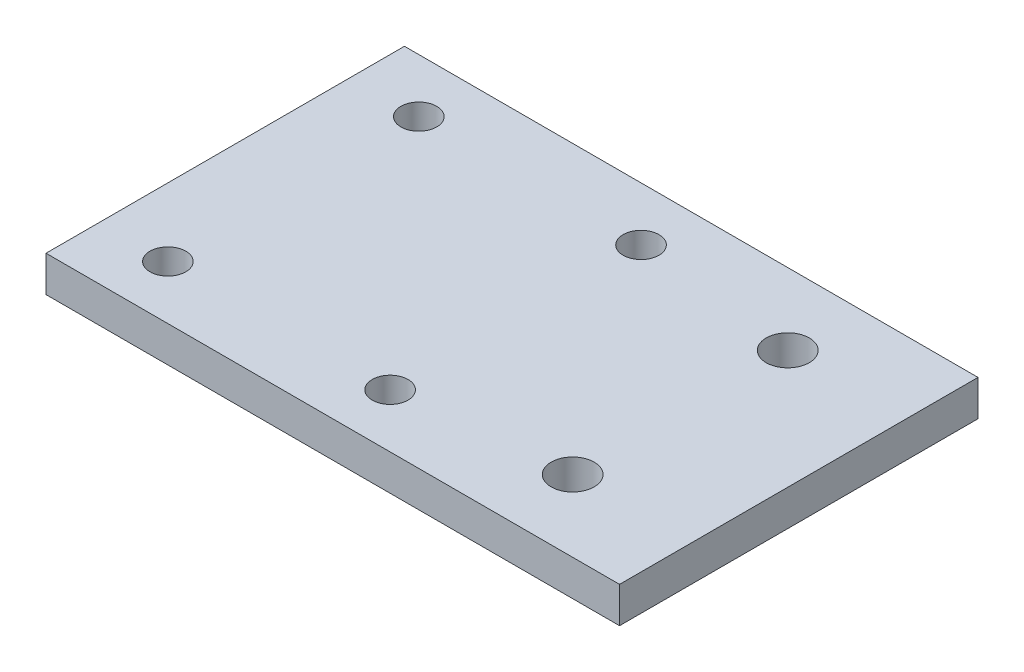
ISO-10303-21;
HEADER;
FILE_DESCRIPTION(('STEP AP214'),'2;1');
FILE_NAME('part.step','',(''),(''),'','','');
FILE_SCHEMA(('AUTOMOTIVE_DESIGN { 1 0 10303 214 1 1 1 1 }'));
ENDSEC;
DATA;
#1=APPLICATION_CONTEXT('core data for automotive mechanical design processes');
#2=APPLICATION_PROTOCOL_DEFINITION('international standard','automotive_design',2000,#1);
#3=PRODUCT_CONTEXT('',#1,'mechanical');
#4=PRODUCT('Part','Part','',(#3));
#5=PRODUCT_RELATED_PRODUCT_CATEGORY('part','',(#4));
#6=PRODUCT_DEFINITION_FORMATION('','',#4);
#7=PRODUCT_DEFINITION_CONTEXT('part definition',#1,'design');
#8=PRODUCT_DEFINITION('design','',#6,#7);
#9=PRODUCT_DEFINITION_SHAPE('','',#8);
#10=(LENGTH_UNIT() NAMED_UNIT(*) SI_UNIT(.MILLI.,.METRE.));
#11=(NAMED_UNIT(*) PLANE_ANGLE_UNIT() SI_UNIT($,.RADIAN.));
#12=(NAMED_UNIT(*) SI_UNIT($,.STERADIAN.) SOLID_ANGLE_UNIT());
#13=UNCERTAINTY_MEASURE_WITH_UNIT(LENGTH_MEASURE(1.E-05),#10,'distance_accuracy_value','');
#14=(GEOMETRIC_REPRESENTATION_CONTEXT(3) GLOBAL_UNCERTAINTY_ASSIGNED_CONTEXT((#13)) GLOBAL_UNIT_ASSIGNED_CONTEXT((#10,
#11,#12)) REPRESENTATION_CONTEXT('',''));
#15=CARTESIAN_POINT('',(0.,0.,0.));
#16=DIRECTION('',(0.,0.,1.));
#17=DIRECTION('',(1.,0.,0.));
#18=AXIS2_PLACEMENT_3D('',#15,#16,#17);
#19=CARTESIAN_POINT('',(0.,5.,0.));
#20=DIRECTION('',(0.,-1.,0.));
#21=DIRECTION('',(0.,0.,-1.));
#22=AXIS2_PLACEMENT_3D('',#19,#20,#21);
#23=PLANE('',#22);
#24=CARTESIAN_POINT('',(9.5,5.,-7.5));
#25=DIRECTION('',(0.,1.,0.));
#26=DIRECTION('',(0.,0.,1.));
#27=AXIS2_PLACEMENT_3D('',#24,#25,#26);
#28=CIRCLE('',#27,2.5);
#29=CARTESIAN_POINT('',(9.5,5.,-5.));
#30=VERTEX_POINT('',#29);
#31=EDGE_CURVE('E117',#30,#30,#28,.T.);
#32=ORIENTED_EDGE('',*,*,#31,.F.);
#33=EDGE_LOOP('',(#32));
#34=FACE_BOUND('',#33,.T.);
#35=CARTESIAN_POINT('',(40.5,5.,-42.5));
#36=DIRECTION('',(0.,1.,0.));
#37=DIRECTION('',(0.,0.,1.));
#38=AXIS2_PLACEMENT_3D('',#35,#36,#37);
#39=CIRCLE('',#38,2.5);
#40=CARTESIAN_POINT('',(40.5,5.,-40.));
#41=VERTEX_POINT('',#40);
#42=EDGE_CURVE('E236',#41,#41,#39,.T.);
#43=ORIENTED_EDGE('',*,*,#42,.F.);
#44=EDGE_LOOP('',(#43));
#45=FACE_BOUND('',#44,.T.);
#46=CARTESIAN_POINT('',(9.5,5.,-42.5));
#47=DIRECTION('',(0.,1.,0.));
#48=DIRECTION('',(0.,0.,1.));
#49=AXIS2_PLACEMENT_3D('',#46,#47,#48);
#50=CIRCLE('',#49,2.5);
#51=CARTESIAN_POINT('',(9.5,5.,-40.));
#52=VERTEX_POINT('',#51);
#53=EDGE_CURVE('E130',#52,#52,#50,.T.);
#54=ORIENTED_EDGE('',*,*,#53,.F.);
#55=EDGE_LOOP('',(#54));
#56=FACE_BOUND('',#55,.T.);
#57=CARTESIAN_POINT('',(40.5,5.,-7.5));
#58=DIRECTION('',(0.,1.,0.));
#59=DIRECTION('',(0.,0.,1.));
#60=AXIS2_PLACEMENT_3D('',#57,#58,#59);
#61=CIRCLE('',#60,2.5);
#62=CARTESIAN_POINT('',(40.5,5.,-5.));
#63=VERTEX_POINT('',#62);
#64=EDGE_CURVE('E113',#63,#63,#61,.T.);
#65=ORIENTED_EDGE('',*,*,#64,.F.);
#66=EDGE_LOOP('',(#65));
#67=FACE_BOUND('',#66,.T.);
#68=DIRECTION('',(0.,0.,1.));
#69=VECTOR('',#68,1.);
#70=CARTESIAN_POINT('',(0.,5.,0.));
#71=LINE('',#70,#69);
#72=CARTESIAN_POINT('',(0.,5.,-50.));
#73=VERTEX_POINT('',#72);
#74=CARTESIAN_POINT('',(0.,5.,0.));
#75=VERTEX_POINT('',#74);
#76=EDGE_CURVE('E87',#73,#75,#71,.T.);
#77=ORIENTED_EDGE('',*,*,#76,.T.);
#78=DIRECTION('',(1.,0.,0.));
#79=VECTOR('',#78,1.);
#80=CARTESIAN_POINT('',(0.,5.,0.));
#81=LINE('',#80,#79);
#82=CARTESIAN_POINT('',(80.,5.,0.));
#83=VERTEX_POINT('',#82);
#84=EDGE_CURVE('E82',#75,#83,#81,.T.);
#85=ORIENTED_EDGE('',*,*,#84,.T.);
#86=DIRECTION('',(0.,0.,-1.));
#87=VECTOR('',#86,1.);
#88=CARTESIAN_POINT('',(80.,5.,0.));
#89=LINE('',#88,#87);
#90=CARTESIAN_POINT('',(80.,5.,-50.));
#91=VERTEX_POINT('',#90);
#92=EDGE_CURVE('E85',#83,#91,#89,.T.);
#93=ORIENTED_EDGE('',*,*,#92,.T.);
#94=DIRECTION('',(-1.,0.,0.));
#95=VECTOR('',#94,1.);
#96=CARTESIAN_POINT('',(0.,5.,-50.));
#97=LINE('',#96,#95);
#98=EDGE_CURVE('E52',#91,#73,#97,.T.);
#99=ORIENTED_EDGE('',*,*,#98,.T.);
#100=EDGE_LOOP('',(#77,#85,#93,#99));
#101=FACE_BOUND('',#100,.T.);
#102=CARTESIAN_POINT('',(63.4615384615385,5.,-10.));
#103=DIRECTION('',(0.,1.,0.));
#104=DIRECTION('',(0.,0.,1.));
#105=AXIS2_PLACEMENT_3D('',#102,#103,#104);
#106=CIRCLE('',#105,3.00000000000001);
#107=CARTESIAN_POINT('',(63.4615384615385,5.,-6.99999999999999));
#108=VERTEX_POINT('',#107);
#109=EDGE_CURVE('E103',#108,#108,#106,.T.);
#110=ORIENTED_EDGE('',*,*,#109,.F.);
#111=EDGE_LOOP('',(#110));
#112=FACE_BOUND('',#111,.T.);
#113=CARTESIAN_POINT('',(63.4615384615385,5.,-40.));
#114=DIRECTION('',(0.,1.,0.));
#115=DIRECTION('',(0.,0.,1.));
#116=AXIS2_PLACEMENT_3D('',#113,#114,#115);
#117=CIRCLE('',#116,3.00000000000001);
#118=CARTESIAN_POINT('',(63.4615384615385,5.,-37.));
#119=VERTEX_POINT('',#118);
#120=EDGE_CURVE('E132',#119,#119,#117,.T.);
#121=ORIENTED_EDGE('',*,*,#120,.F.);
#122=EDGE_LOOP('',(#121));
#123=FACE_BOUND('',#122,.T.);
#124=ADVANCED_FACE('F33',(#34,#45,#56,#67,#101,#112,#123),#23,.F.);
#125=CARTESIAN_POINT('',(0.,0.,0.));
#126=DIRECTION('',(0.,-1.,0.));
#127=DIRECTION('',(0.,0.,-1.));
#128=AXIS2_PLACEMENT_3D('',#125,#126,#127);
#129=PLANE('',#128);
#130=CARTESIAN_POINT('',(9.5,0.,-7.5));
#131=DIRECTION('',(0.,-1.,0.));
#132=DIRECTION('',(0.,0.,-1.));
#133=AXIS2_PLACEMENT_3D('',#130,#131,#132);
#134=CIRCLE('',#133,2.5);
#135=CARTESIAN_POINT('',(9.5,0.,-10.));
#136=VERTEX_POINT('',#135);
#137=EDGE_CURVE('E37',#136,#136,#134,.T.);
#138=ORIENTED_EDGE('',*,*,#137,.F.);
#139=EDGE_LOOP('',(#138));
#140=FACE_BOUND('',#139,.T.);
#141=CARTESIAN_POINT('',(40.5,0.,-42.5));
#142=DIRECTION('',(0.,-1.,0.));
#143=DIRECTION('',(0.,0.,-1.));
#144=AXIS2_PLACEMENT_3D('',#141,#142,#143);
#145=CIRCLE('',#144,2.5);
#146=CARTESIAN_POINT('',(40.5,0.,-45.));
#147=VERTEX_POINT('',#146);
#148=EDGE_CURVE('E116',#147,#147,#145,.T.);
#149=ORIENTED_EDGE('',*,*,#148,.F.);
#150=EDGE_LOOP('',(#149));
#151=FACE_BOUND('',#150,.T.);
#152=CARTESIAN_POINT('',(9.5,0.,-42.5));
#153=DIRECTION('',(0.,-1.,0.));
#154=DIRECTION('',(0.,0.,-1.));
#155=AXIS2_PLACEMENT_3D('',#152,#153,#154);
#156=CIRCLE('',#155,2.5);
#157=CARTESIAN_POINT('',(9.5,0.,-45.));
#158=VERTEX_POINT('',#157);
#159=EDGE_CURVE('E114',#158,#158,#156,.T.);
#160=ORIENTED_EDGE('',*,*,#159,.F.);
#161=EDGE_LOOP('',(#160));
#162=FACE_BOUND('',#161,.T.);
#163=CARTESIAN_POINT('',(40.5,0.,-7.5));
#164=DIRECTION('',(0.,-1.,0.));
#165=DIRECTION('',(0.,0.,-1.));
#166=AXIS2_PLACEMENT_3D('',#163,#164,#165);
#167=CIRCLE('',#166,2.5);
#168=CARTESIAN_POINT('',(40.5,0.,-10.));
#169=VERTEX_POINT('',#168);
#170=EDGE_CURVE('E109',#169,#169,#167,.T.);
#171=ORIENTED_EDGE('',*,*,#170,.F.);
#172=EDGE_LOOP('',(#171));
#173=FACE_BOUND('',#172,.T.);
#174=CARTESIAN_POINT('',(63.4615384615385,0.,-10.));
#175=DIRECTION('',(0.,1.,0.));
#176=DIRECTION('',(0.,0.,1.));
#177=AXIS2_PLACEMENT_3D('',#174,#175,#176);
#178=CIRCLE('',#177,3.00000000000001);
#179=CARTESIAN_POINT('',(63.4615384615385,0.,-6.99999999999999));
#180=VERTEX_POINT('',#179);
#181=EDGE_CURVE('E135',#180,#180,#178,.T.);
#182=ORIENTED_EDGE('',*,*,#181,.T.);
#183=EDGE_LOOP('',(#182));
#184=FACE_BOUND('',#183,.T.);
#185=DIRECTION('',(0.,0.,1.));
#186=VECTOR('',#185,1.);
#187=CARTESIAN_POINT('',(0.,0.,0.));
#188=LINE('',#187,#186);
#189=CARTESIAN_POINT('',(0.,0.,-50.));
#190=VERTEX_POINT('',#189);
#191=CARTESIAN_POINT('',(0.,0.,0.));
#192=VERTEX_POINT('',#191);
#193=EDGE_CURVE('E100',#190,#192,#188,.T.);
#194=ORIENTED_EDGE('',*,*,#193,.F.);
#195=DIRECTION('',(-1.,0.,0.));
#196=VECTOR('',#195,1.);
#197=CARTESIAN_POINT('',(0.,0.,-50.));
#198=LINE('',#197,#196);
#199=CARTESIAN_POINT('',(80.,0.,-50.));
#200=VERTEX_POINT('',#199);
#201=EDGE_CURVE('E75',#200,#190,#198,.T.);
#202=ORIENTED_EDGE('',*,*,#201,.F.);
#203=DIRECTION('',(0.,0.,-1.));
#204=VECTOR('',#203,1.);
#205=CARTESIAN_POINT('',(80.,0.,0.));
#206=LINE('',#205,#204);
#207=CARTESIAN_POINT('',(80.,0.,0.));
#208=VERTEX_POINT('',#207);
#209=EDGE_CURVE('E69',#208,#200,#206,.T.);
#210=ORIENTED_EDGE('',*,*,#209,.F.);
#211=DIRECTION('',(1.,0.,0.));
#212=VECTOR('',#211,1.);
#213=CARTESIAN_POINT('',(0.,0.,0.));
#214=LINE('',#213,#212);
#215=EDGE_CURVE('E91',#192,#208,#214,.T.);
#216=ORIENTED_EDGE('',*,*,#215,.F.);
#217=EDGE_LOOP('',(#194,#202,#210,#216));
#218=FACE_BOUND('',#217,.T.);
#219=CARTESIAN_POINT('',(63.4615384615385,0.,-40.));
#220=DIRECTION('',(0.,1.,0.));
#221=DIRECTION('',(0.,0.,1.));
#222=AXIS2_PLACEMENT_3D('',#219,#220,#221);
#223=CIRCLE('',#222,3.00000000000001);
#224=CARTESIAN_POINT('',(63.4615384615385,0.,-37.));
#225=VERTEX_POINT('',#224);
#226=EDGE_CURVE('E112',#225,#225,#223,.T.);
#227=ORIENTED_EDGE('',*,*,#226,.T.);
#228=EDGE_LOOP('',(#227));
#229=FACE_BOUND('',#228,.T.);
#230=ADVANCED_FACE('F143',(#140,#151,#162,#173,#184,#218,#229),#129,.T.);
#231=CARTESIAN_POINT('',(0.,5.,0.));
#232=DIRECTION('',(1.,0.,0.));
#233=DIRECTION('',(0.,0.,-1.));
#234=AXIS2_PLACEMENT_3D('',#231,#232,#233);
#235=PLANE('',#234);
#236=ORIENTED_EDGE('',*,*,#193,.T.);
#237=DIRECTION('',(0.,-1.,0.));
#238=VECTOR('',#237,1.);
#239=CARTESIAN_POINT('',(0.,5.,0.));
#240=LINE('',#239,#238);
#241=EDGE_CURVE('E11',#75,#192,#240,.T.);
#242=ORIENTED_EDGE('',*,*,#241,.F.);
#243=ORIENTED_EDGE('',*,*,#76,.F.);
#244=DIRECTION('',(0.,-1.,0.));
#245=VECTOR('',#244,1.);
#246=CARTESIAN_POINT('',(0.,5.,-50.));
#247=LINE('',#246,#245);
#248=EDGE_CURVE('E96',#73,#190,#247,.T.);
#249=ORIENTED_EDGE('',*,*,#248,.T.);
#250=EDGE_LOOP('',(#236,#242,#243,#249));
#251=FACE_BOUND('',#250,.T.);
#252=ADVANCED_FACE('F35',(#251),#235,.F.);
#253=CARTESIAN_POINT('',(0.,5.,0.));
#254=DIRECTION('',(0.,0.,-1.));
#255=DIRECTION('',(-1.,0.,0.));
#256=AXIS2_PLACEMENT_3D('',#253,#254,#255);
#257=PLANE('',#256);
#258=ORIENTED_EDGE('',*,*,#215,.T.);
#259=DIRECTION('',(0.,-1.,0.));
#260=VECTOR('',#259,1.);
#261=CARTESIAN_POINT('',(80.,5.,0.));
#262=LINE('',#261,#260);
#263=EDGE_CURVE('E43',#83,#208,#262,.T.);
#264=ORIENTED_EDGE('',*,*,#263,.F.);
#265=ORIENTED_EDGE('',*,*,#84,.F.);
#266=ORIENTED_EDGE('',*,*,#241,.T.);
#267=EDGE_LOOP('',(#258,#264,#265,#266));
#268=FACE_BOUND('',#267,.T.);
#269=ADVANCED_FACE('F90',(#268),#257,.F.);
#270=CARTESIAN_POINT('',(80.,5.,0.));
#271=DIRECTION('',(-1.,0.,0.));
#272=DIRECTION('',(0.,0.,1.));
#273=AXIS2_PLACEMENT_3D('',#270,#271,#272);
#274=PLANE('',#273);
#275=ORIENTED_EDGE('',*,*,#209,.T.);
#276=DIRECTION('',(0.,-1.,0.));
#277=VECTOR('',#276,1.);
#278=CARTESIAN_POINT('',(80.,5.,-50.));
#279=LINE('',#278,#277);
#280=EDGE_CURVE('E92',#91,#200,#279,.T.);
#281=ORIENTED_EDGE('',*,*,#280,.F.);
#282=ORIENTED_EDGE('',*,*,#92,.F.);
#283=ORIENTED_EDGE('',*,*,#263,.T.);
#284=EDGE_LOOP('',(#275,#281,#282,#283));
#285=FACE_BOUND('',#284,.T.);
#286=ADVANCED_FACE('F94',(#285),#274,.F.);
#287=CARTESIAN_POINT('',(0.,5.,-50.));
#288=DIRECTION('',(0.,0.,1.));
#289=DIRECTION('',(1.,0.,0.));
#290=AXIS2_PLACEMENT_3D('',#287,#288,#289);
#291=PLANE('',#290);
#292=ORIENTED_EDGE('',*,*,#201,.T.);
#293=ORIENTED_EDGE('',*,*,#248,.F.);
#294=ORIENTED_EDGE('',*,*,#98,.F.);
#295=ORIENTED_EDGE('',*,*,#280,.T.);
#296=EDGE_LOOP('',(#292,#293,#294,#295));
#297=FACE_BOUND('',#296,.T.);
#298=ADVANCED_FACE('F149',(#297),#291,.F.);
#299=CARTESIAN_POINT('',(63.4615384615385,5.,-10.));
#300=DIRECTION('',(0.,-1.,0.));
#301=DIRECTION('',(0.,0.,-1.));
#302=AXIS2_PLACEMENT_3D('',#299,#300,#301);
#303=CYLINDRICAL_SURFACE('',#302,3.00000000000001);
#304=ORIENTED_EDGE('',*,*,#109,.T.);
#305=EDGE_LOOP('',(#304));
#306=FACE_BOUND('',#305,.T.);
#307=ORIENTED_EDGE('',*,*,#181,.F.);
#308=EDGE_LOOP('',(#307));
#309=FACE_BOUND('',#308,.T.);
#310=ADVANCED_FACE('F146',(#306,#309),#303,.F.);
#311=CARTESIAN_POINT('',(63.4615384615385,5.,-40.));
#312=DIRECTION('',(0.,-1.,0.));
#313=DIRECTION('',(0.,0.,-1.));
#314=AXIS2_PLACEMENT_3D('',#311,#312,#313);
#315=CYLINDRICAL_SURFACE('',#314,3.00000000000001);
#316=ORIENTED_EDGE('',*,*,#120,.T.);
#317=EDGE_LOOP('',(#316));
#318=FACE_BOUND('',#317,.T.);
#319=ORIENTED_EDGE('',*,*,#226,.F.);
#320=EDGE_LOOP('',(#319));
#321=FACE_BOUND('',#320,.T.);
#322=ADVANCED_FACE('F148',(#318,#321),#315,.F.);
#323=CARTESIAN_POINT('',(40.5,-5.,-7.5));
#324=DIRECTION('',(0.,1.,0.));
#325=DIRECTION('',(0.,0.,1.));
#326=AXIS2_PLACEMENT_3D('',#323,#324,#325);
#327=CYLINDRICAL_SURFACE('',#326,2.5);
#328=ORIENTED_EDGE('',*,*,#170,.T.);
#329=EDGE_LOOP('',(#328));
#330=FACE_BOUND('',#329,.T.);
#331=ORIENTED_EDGE('',*,*,#64,.T.);
#332=EDGE_LOOP('',(#331));
#333=FACE_BOUND('',#332,.T.);
#334=ADVANCED_FACE('F156',(#330,#333),#327,.F.);
#335=CARTESIAN_POINT('',(9.5,-5.,-42.5));
#336=DIRECTION('',(0.,1.,0.));
#337=DIRECTION('',(0.,0.,1.));
#338=AXIS2_PLACEMENT_3D('',#335,#336,#337);
#339=CYLINDRICAL_SURFACE('',#338,2.5);
#340=ORIENTED_EDGE('',*,*,#159,.T.);
#341=EDGE_LOOP('',(#340));
#342=FACE_BOUND('',#341,.T.);
#343=ORIENTED_EDGE('',*,*,#53,.T.);
#344=EDGE_LOOP('',(#343));
#345=FACE_BOUND('',#344,.T.);
#346=ADVANCED_FACE('F201',(#342,#345),#339,.F.);
#347=CARTESIAN_POINT('',(40.5,-5.,-42.5));
#348=DIRECTION('',(0.,1.,0.));
#349=DIRECTION('',(0.,0.,1.));
#350=AXIS2_PLACEMENT_3D('',#347,#348,#349);
#351=CYLINDRICAL_SURFACE('',#350,2.5);
#352=ORIENTED_EDGE('',*,*,#148,.T.);
#353=EDGE_LOOP('',(#352));
#354=FACE_BOUND('',#353,.T.);
#355=ORIENTED_EDGE('',*,*,#42,.T.);
#356=EDGE_LOOP('',(#355));
#357=FACE_BOUND('',#356,.T.);
#358=ADVANCED_FACE('F212',(#354,#357),#351,.F.);
#359=CARTESIAN_POINT('',(9.5,-5.,-7.5));
#360=DIRECTION('',(0.,1.,0.));
#361=DIRECTION('',(0.,0.,1.));
#362=AXIS2_PLACEMENT_3D('',#359,#360,#361);
#363=CYLINDRICAL_SURFACE('',#362,2.5);
#364=ORIENTED_EDGE('',*,*,#137,.T.);
#365=EDGE_LOOP('',(#364));
#366=FACE_BOUND('',#365,.T.);
#367=ORIENTED_EDGE('',*,*,#31,.T.);
#368=EDGE_LOOP('',(#367));
#369=FACE_BOUND('',#368,.T.);
#370=ADVANCED_FACE('F222',(#366,#369),#363,.F.);
#371=CLOSED_SHELL('',(#124,#230,#252,#269,#286,#298,#310,#322,#334,#346,#358,#370));
#372=MANIFOLD_SOLID_BREP('B2',#371);
#373=ADVANCED_BREP_SHAPE_REPRESENTATION('',(#18,#372),#14);
#374=SHAPE_DEFINITION_REPRESENTATION(#9,#373);
ENDSEC;
END-ISO-10303-21;
